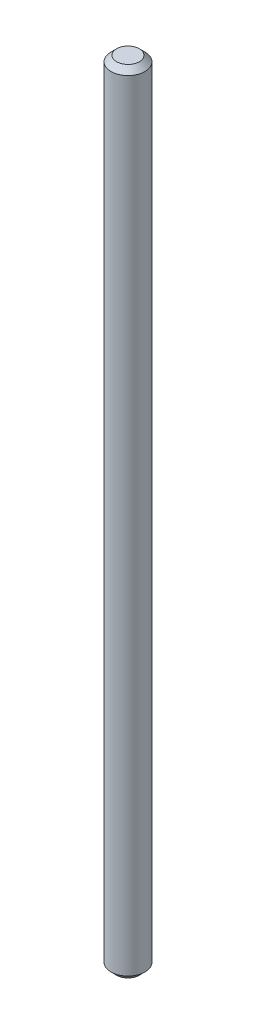
ISO-10303-21;
HEADER;
FILE_DESCRIPTION(('STEP AP214'),'2;1');
FILE_NAME('part.step','',(''),(''),'','','');
FILE_SCHEMA(('AUTOMOTIVE_DESIGN { 1 0 10303 214 1 1 1 1 }'));
ENDSEC;
DATA;
#1=APPLICATION_CONTEXT('core data for automotive mechanical design processes');
#2=APPLICATION_PROTOCOL_DEFINITION('international standard','automotive_design',2000,#1);
#3=PRODUCT_CONTEXT('',#1,'mechanical');
#4=PRODUCT('Part','Part','',(#3));
#5=PRODUCT_RELATED_PRODUCT_CATEGORY('part','',(#4));
#6=PRODUCT_DEFINITION_FORMATION('','',#4);
#7=PRODUCT_DEFINITION_CONTEXT('part definition',#1,'design');
#8=PRODUCT_DEFINITION('design','',#6,#7);
#9=PRODUCT_DEFINITION_SHAPE('','',#8);
#10=(LENGTH_UNIT() NAMED_UNIT(*) SI_UNIT(.MILLI.,.METRE.));
#11=(NAMED_UNIT(*) PLANE_ANGLE_UNIT() SI_UNIT($,.RADIAN.));
#12=(NAMED_UNIT(*) SI_UNIT($,.STERADIAN.) SOLID_ANGLE_UNIT());
#13=UNCERTAINTY_MEASURE_WITH_UNIT(LENGTH_MEASURE(1.E-05),#10,'distance_accuracy_value','');
#14=(GEOMETRIC_REPRESENTATION_CONTEXT(3) GLOBAL_UNCERTAINTY_ASSIGNED_CONTEXT((#13)) GLOBAL_UNIT_ASSIGNED_CONTEXT((#10,
#11,#12)) REPRESENTATION_CONTEXT('',''));
#15=CARTESIAN_POINT('',(0.,0.,0.));
#16=DIRECTION('',(0.,0.,1.));
#17=DIRECTION('',(1.,0.,0.));
#18=AXIS2_PLACEMENT_3D('',#15,#16,#17);
#19=CARTESIAN_POINT('',(0.,140.,0.));
#20=DIRECTION('',(0.,-1.,0.));
#21=DIRECTION('',(0.,0.,-1.));
#22=AXIS2_PLACEMENT_3D('',#19,#20,#21);
#23=CYLINDRICAL_SURFACE('',#22,3.);
#24=CARTESIAN_POINT('',(0.,1.,0.));
#25=DIRECTION('',(0.,1.,0.));
#26=DIRECTION('',(0.,0.,1.));
#27=AXIS2_PLACEMENT_3D('',#24,#25,#26);
#28=CIRCLE('',#27,3.);
#29=CARTESIAN_POINT('',(0.,1.,3.));
#30=VERTEX_POINT('',#29);
#31=EDGE_CURVE('E49',#30,#30,#28,.T.);
#32=ORIENTED_EDGE('',*,*,#31,.T.);
#33=EDGE_LOOP('',(#32));
#34=FACE_BOUND('',#33,.T.);
#35=CARTESIAN_POINT('',(0.,139.,0.));
#36=DIRECTION('',(0.,1.,0.));
#37=DIRECTION('',(0.,0.,1.));
#38=AXIS2_PLACEMENT_3D('',#35,#36,#37);
#39=CIRCLE('',#38,3.);
#40=CARTESIAN_POINT('',(0.,139.,3.));
#41=VERTEX_POINT('',#40);
#42=EDGE_CURVE('E54',#41,#41,#39,.F.);
#43=ORIENTED_EDGE('',*,*,#42,.T.);
#44=EDGE_LOOP('',(#43));
#45=FACE_BOUND('',#44,.T.);
#46=ADVANCED_FACE('F36',(#34,#45),#23,.T.);
#47=CARTESIAN_POINT('',(0.,140.,0.));
#48=DIRECTION('',(0.,1.,0.));
#49=DIRECTION('',(0.,0.,1.));
#50=AXIS2_PLACEMENT_3D('',#47,#48,#49);
#51=PLANE('',#50);
#52=CARTESIAN_POINT('',(0.,140.,0.));
#53=DIRECTION('',(0.,1.,0.));
#54=DIRECTION('',(0.,0.,1.));
#55=AXIS2_PLACEMENT_3D('',#52,#53,#54);
#56=CIRCLE('',#55,2.00000000000003);
#57=CARTESIAN_POINT('',(0.,140.,2.00000000000003));
#58=VERTEX_POINT('',#57);
#59=EDGE_CURVE('E10',#58,#58,#56,.T.);
#60=ORIENTED_EDGE('',*,*,#59,.T.);
#61=EDGE_LOOP('',(#60));
#62=FACE_BOUND('',#61,.T.);
#63=ADVANCED_FACE('F71',(#62),#51,.T.);
#64=CARTESIAN_POINT('',(0.,0.,0.));
#65=DIRECTION('',(0.,1.,0.));
#66=DIRECTION('',(0.,0.,1.));
#67=AXIS2_PLACEMENT_3D('',#64,#65,#66);
#68=PLANE('',#67);
#69=CARTESIAN_POINT('',(0.,0.,0.));
#70=DIRECTION('',(0.,1.,0.));
#71=DIRECTION('',(0.,0.,1.));
#72=AXIS2_PLACEMENT_3D('',#69,#70,#71);
#73=CIRCLE('',#72,2.);
#74=CARTESIAN_POINT('',(0.,0.,2.));
#75=VERTEX_POINT('',#74);
#76=EDGE_CURVE('E44',#75,#75,#73,.F.);
#77=ORIENTED_EDGE('',*,*,#76,.T.);
#78=EDGE_LOOP('',(#77));
#79=FACE_BOUND('',#78,.T.);
#80=ADVANCED_FACE('F68',(#79),#68,.F.);
#81=CARTESIAN_POINT('',(0.,1.,0.));
#82=DIRECTION('',(0.,1.,0.));
#83=DIRECTION('',(0.,0.,1.));
#84=AXIS2_PLACEMENT_3D('',#81,#82,#83);
#85=CONICAL_SURFACE('',#84,3.,0.785398163397447);
#86=ORIENTED_EDGE('',*,*,#76,.F.);
#87=EDGE_LOOP('',(#86));
#88=FACE_BOUND('',#87,.T.);
#89=ORIENTED_EDGE('',*,*,#31,.F.);
#90=EDGE_LOOP('',(#89));
#91=FACE_BOUND('',#90,.T.);
#92=ADVANCED_FACE('F64',(#88,#91),#85,.T.);
#93=CARTESIAN_POINT('',(0.,140.,0.));
#94=DIRECTION('',(0.,-1.,0.));
#95=DIRECTION('',(0.,0.,-1.));
#96=AXIS2_PLACEMENT_3D('',#93,#94,#95);
#97=CONICAL_SURFACE('',#96,2.00000000000003,0.785398163397447);
#98=ORIENTED_EDGE('',*,*,#42,.F.);
#99=EDGE_LOOP('',(#98));
#100=FACE_BOUND('',#99,.T.);
#101=ORIENTED_EDGE('',*,*,#59,.F.);
#102=EDGE_LOOP('',(#101));
#103=FACE_BOUND('',#102,.T.);
#104=ADVANCED_FACE('F38',(#100,#103),#97,.T.);
#105=CLOSED_SHELL('',(#46,#63,#80,#92,#104));
#106=MANIFOLD_SOLID_BREP('B2',#105);
#107=ADVANCED_BREP_SHAPE_REPRESENTATION('',(#18,#106),#14);
#108=SHAPE_DEFINITION_REPRESENTATION(#9,#107);
ENDSEC;
END-ISO-10303-21;
